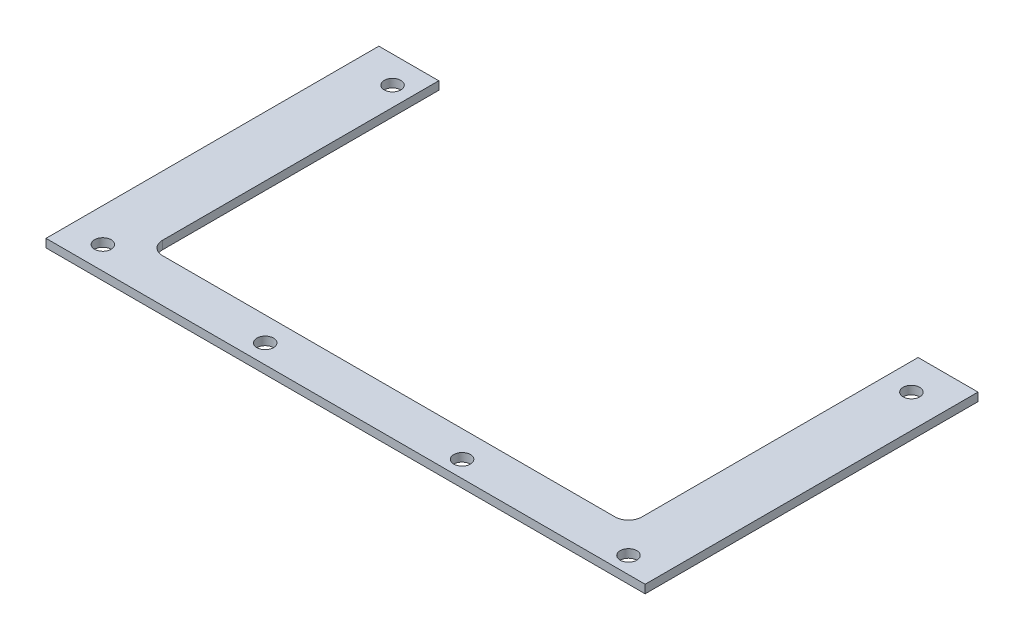
ISO-10303-21;
HEADER;
FILE_DESCRIPTION(('STEP AP214'),'2;1');
FILE_NAME('part.step','',(''),(''),'','','');
FILE_SCHEMA(('AUTOMOTIVE_DESIGN { 1 0 10303 214 1 1 1 1 }'));
ENDSEC;
DATA;
#1=APPLICATION_CONTEXT('core data for automotive mechanical design processes');
#2=APPLICATION_PROTOCOL_DEFINITION('international standard','automotive_design',2000,#1);
#3=PRODUCT_CONTEXT('',#1,'mechanical');
#4=PRODUCT('Part','Part','',(#3));
#5=PRODUCT_RELATED_PRODUCT_CATEGORY('part','',(#4));
#6=PRODUCT_DEFINITION_FORMATION('','',#4);
#7=PRODUCT_DEFINITION_CONTEXT('part definition',#1,'design');
#8=PRODUCT_DEFINITION('design','',#6,#7);
#9=PRODUCT_DEFINITION_SHAPE('','',#8);
#10=(LENGTH_UNIT() NAMED_UNIT(*) SI_UNIT(.MILLI.,.METRE.));
#11=(NAMED_UNIT(*) PLANE_ANGLE_UNIT() SI_UNIT($,.RADIAN.));
#12=(NAMED_UNIT(*) SI_UNIT($,.STERADIAN.) SOLID_ANGLE_UNIT());
#13=UNCERTAINTY_MEASURE_WITH_UNIT(LENGTH_MEASURE(1.E-05),#10,'distance_accuracy_value','');
#14=(GEOMETRIC_REPRESENTATION_CONTEXT(3) GLOBAL_UNCERTAINTY_ASSIGNED_CONTEXT((#13)) GLOBAL_UNIT_ASSIGNED_CONTEXT((#10,
#11,#12)) REPRESENTATION_CONTEXT('',''));
#15=CARTESIAN_POINT('',(0.,0.,0.));
#16=DIRECTION('',(0.,0.,1.));
#17=DIRECTION('',(1.,0.,0.));
#18=AXIS2_PLACEMENT_3D('',#15,#16,#17);
#19=CARTESIAN_POINT('',(-86.3600000000036,28.575000000001,-237.490000000001));
#20=DIRECTION('',(0.,-1.,0.));
#21=DIRECTION('',(0.,0.,-1.));
#22=AXIS2_PLACEMENT_3D('',#19,#20,#21);
#23=CYLINDRICAL_SURFACE('',#22,5.07999999999998);
#24=CARTESIAN_POINT('',(-86.3600000000036,25.400000000001,-237.490000000001));
#25=DIRECTION('',(0.,1.,0.));
#26=DIRECTION('',(-1.,0.,0.));
#27=AXIS2_PLACEMENT_3D('',#24,#25,#26);
#28=CIRCLE('',#27,5.07999999999998);
#29=CARTESIAN_POINT('',(-91.4400000000036,25.400000000001,-237.490000000001));
#30=VERTEX_POINT('',#29);
#31=CARTESIAN_POINT('',(-86.3600000000036,25.400000000001,-232.410000000001));
#32=VERTEX_POINT('',#31);
#33=EDGE_CURVE('E142',#30,#32,#28,.T.);
#34=ORIENTED_EDGE('',*,*,#33,.F.);
#35=DIRECTION('',(0.,-1.,0.));
#36=VECTOR('',#35,1.);
#37=CARTESIAN_POINT('',(-91.4400000000036,28.575000000001,-237.490000000001));
#38=LINE('',#37,#36);
#39=CARTESIAN_POINT('',(-91.4400000000036,28.575000000001,-237.490000000001));
#40=VERTEX_POINT('',#39);
#41=EDGE_CURVE('E11',#40,#30,#38,.T.);
#42=ORIENTED_EDGE('',*,*,#41,.F.);
#43=CARTESIAN_POINT('',(-86.3600000000036,28.575000000001,-237.490000000001));
#44=DIRECTION('',(0.,1.,0.));
#45=DIRECTION('',(-1.,0.,0.));
#46=AXIS2_PLACEMENT_3D('',#43,#44,#45);
#47=CIRCLE('',#46,5.07999999999998);
#48=CARTESIAN_POINT('',(-86.3600000000036,28.575000000001,-232.410000000001));
#49=VERTEX_POINT('',#48);
#50=EDGE_CURVE('E166',#40,#49,#47,.T.);
#51=ORIENTED_EDGE('',*,*,#50,.T.);
#52=DIRECTION('',(0.,-1.,0.));
#53=VECTOR('',#52,1.);
#54=CARTESIAN_POINT('',(-86.3600000000036,28.575000000001,-232.410000000001));
#55=LINE('',#54,#53);
#56=EDGE_CURVE('E53',#49,#32,#55,.T.);
#57=ORIENTED_EDGE('',*,*,#56,.T.);
#58=EDGE_LOOP('',(#34,#42,#51,#57));
#59=FACE_BOUND('',#58,.T.);
#60=ADVANCED_FACE('F37',(#59),#23,.F.);
#61=CARTESIAN_POINT('',(-91.4400000000036,28.5750000000009,0.));
#62=DIRECTION('',(-1.,0.,0.));
#63=DIRECTION('',(0.,0.,1.));
#64=AXIS2_PLACEMENT_3D('',#61,#62,#63);
#65=PLANE('',#64);
#66=DIRECTION('',(0.,0.,-1.));
#67=VECTOR('',#66,1.);
#68=CARTESIAN_POINT('',(-91.4400000000036,25.4000000000009,0.));
#69=LINE('',#68,#67);
#70=CARTESIAN_POINT('',(-91.4400000000035,25.400000000001,-342.899999999985));
#71=VERTEX_POINT('',#70);
#72=EDGE_CURVE('E144',#30,#71,#69,.T.);
#73=ORIENTED_EDGE('',*,*,#72,.T.);
#74=DIRECTION('',(0.,-1.,0.));
#75=VECTOR('',#74,1.);
#76=CARTESIAN_POINT('',(-91.4400000000035,28.575000000001,-342.899999999985));
#77=LINE('',#76,#75);
#78=CARTESIAN_POINT('',(-91.4400000000035,28.575000000001,-342.899999999985));
#79=VERTEX_POINT('',#78);
#80=EDGE_CURVE('E45',#79,#71,#77,.T.);
#81=ORIENTED_EDGE('',*,*,#80,.F.);
#82=DIRECTION('',(0.,0.,-1.));
#83=VECTOR('',#82,1.);
#84=CARTESIAN_POINT('',(-91.4400000000036,28.5750000000009,0.));
#85=LINE('',#84,#83);
#86=EDGE_CURVE('E199',#40,#79,#85,.T.);
#87=ORIENTED_EDGE('',*,*,#86,.F.);
#88=ORIENTED_EDGE('',*,*,#41,.T.);
#89=EDGE_LOOP('',(#73,#81,#87,#88));
#90=FACE_BOUND('',#89,.T.);
#91=ADVANCED_FACE('F187',(#90),#65,.F.);
#92=CARTESIAN_POINT('',(0.,28.575000000001,-342.899999999985));
#93=DIRECTION('',(0.,0.,-1.));
#94=DIRECTION('',(0.,1.,0.));
#95=AXIS2_PLACEMENT_3D('',#92,#93,#94);
#96=PLANE('',#95);
#97=DIRECTION('',(1.,0.,0.));
#98=VECTOR('',#97,1.);
#99=CARTESIAN_POINT('',(0.,25.400000000001,-342.899999999985));
#100=LINE('',#99,#98);
#101=CARTESIAN_POINT('',(-114.300000000203,25.400000000001,-342.899999999985));
#102=VERTEX_POINT('',#101);
#103=EDGE_CURVE('E148',#102,#71,#100,.T.);
#104=ORIENTED_EDGE('',*,*,#103,.F.);
#105=DIRECTION('',(0.,-1.,0.));
#106=VECTOR('',#105,1.);
#107=CARTESIAN_POINT('',(-114.300000000203,28.575000000001,-342.899999999985));
#108=LINE('',#107,#106);
#109=CARTESIAN_POINT('',(-114.300000000203,28.575000000001,-342.899999999985));
#110=VERTEX_POINT('',#109);
#111=EDGE_CURVE('E177',#110,#102,#108,.T.);
#112=ORIENTED_EDGE('',*,*,#111,.F.);
#113=DIRECTION('',(1.,0.,0.));
#114=VECTOR('',#113,1.);
#115=CARTESIAN_POINT('',(0.,28.575000000001,-342.899999999985));
#116=LINE('',#115,#114);
#117=EDGE_CURVE('E184',#110,#79,#116,.T.);
#118=ORIENTED_EDGE('',*,*,#117,.T.);
#119=ORIENTED_EDGE('',*,*,#80,.T.);
#120=EDGE_LOOP('',(#104,#112,#118,#119));
#121=FACE_BOUND('',#120,.T.);
#122=ADVANCED_FACE('F182',(#121),#96,.T.);
#123=CARTESIAN_POINT('',(-114.300000000203,28.5750000000009,0.));
#124=DIRECTION('',(-1.,0.,0.));
#125=DIRECTION('',(0.,-1.,0.));
#126=AXIS2_PLACEMENT_3D('',#123,#124,#125);
#127=PLANE('',#126);
#128=DIRECTION('',(0.,0.,-1.));
#129=VECTOR('',#128,1.);
#130=CARTESIAN_POINT('',(-114.300000000203,25.4000000000009,0.));
#131=LINE('',#130,#129);
#132=CARTESIAN_POINT('',(-114.300000000203,25.400000000001,-215.899999999985));
#133=VERTEX_POINT('',#132);
#134=EDGE_CURVE('E151',#133,#102,#131,.T.);
#135=ORIENTED_EDGE('',*,*,#134,.F.);
#136=DIRECTION('',(0.,-1.,0.));
#137=VECTOR('',#136,1.);
#138=CARTESIAN_POINT('',(-114.300000000203,28.575000000001,-215.899999999985));
#139=LINE('',#138,#137);
#140=CARTESIAN_POINT('',(-114.300000000203,28.575000000001,-215.899999999985));
#141=VERTEX_POINT('',#140);
#142=EDGE_CURVE('E175',#141,#133,#139,.T.);
#143=ORIENTED_EDGE('',*,*,#142,.F.);
#144=DIRECTION('',(0.,0.,-1.));
#145=VECTOR('',#144,1.);
#146=CARTESIAN_POINT('',(-114.300000000203,28.5750000000009,0.));
#147=LINE('',#146,#145);
#148=EDGE_CURVE('E198',#141,#110,#147,.T.);
#149=ORIENTED_EDGE('',*,*,#148,.T.);
#150=ORIENTED_EDGE('',*,*,#111,.T.);
#151=EDGE_LOOP('',(#135,#143,#149,#150));
#152=FACE_BOUND('',#151,.T.);
#153=ADVANCED_FACE('F194',(#152),#127,.T.);
#154=CARTESIAN_POINT('',(0.,28.575000000001,-215.899999999986));
#155=DIRECTION('',(0.,0.,-1.));
#156=DIRECTION('',(0.,1.,0.));
#157=AXIS2_PLACEMENT_3D('',#154,#155,#156);
#158=PLANE('',#157);
#159=DIRECTION('',(1.,0.,0.));
#160=VECTOR('',#159,1.);
#161=CARTESIAN_POINT('',(0.,25.400000000001,-215.899999999986));
#162=LINE('',#161,#160);
#163=CARTESIAN_POINT('',(114.299999999797,25.400000000001,-215.899999999986));
#164=VERTEX_POINT('',#163);
#165=EDGE_CURVE('E155',#133,#164,#162,.T.);
#166=ORIENTED_EDGE('',*,*,#165,.T.);
#167=DIRECTION('',(0.,-1.,0.));
#168=VECTOR('',#167,1.);
#169=CARTESIAN_POINT('',(114.299999999797,28.575000000001,-215.899999999986));
#170=LINE('',#169,#168);
#171=CARTESIAN_POINT('',(114.299999999797,28.575000000001,-215.899999999986));
#172=VERTEX_POINT('',#171);
#173=EDGE_CURVE('E172',#172,#164,#170,.T.);
#174=ORIENTED_EDGE('',*,*,#173,.F.);
#175=DIRECTION('',(1.,0.,0.));
#176=VECTOR('',#175,1.);
#177=CARTESIAN_POINT('',(0.,28.575000000001,-215.899999999986));
#178=LINE('',#177,#176);
#179=EDGE_CURVE('E201',#141,#172,#178,.T.);
#180=ORIENTED_EDGE('',*,*,#179,.F.);
#181=ORIENTED_EDGE('',*,*,#142,.T.);
#182=EDGE_LOOP('',(#166,#174,#180,#181));
#183=FACE_BOUND('',#182,.T.);
#184=ADVANCED_FACE('F211',(#183),#158,.F.);
#185=CARTESIAN_POINT('',(114.299999999797,28.575000000001,0.));
#186=DIRECTION('',(-1.,0.,0.));
#187=DIRECTION('',(0.,-1.,0.));
#188=AXIS2_PLACEMENT_3D('',#185,#186,#187);
#189=PLANE('',#188);
#190=DIRECTION('',(0.,0.,-1.));
#191=VECTOR('',#190,1.);
#192=CARTESIAN_POINT('',(114.299999999797,25.400000000001,0.));
#193=LINE('',#192,#191);
#194=CARTESIAN_POINT('',(114.299999999797,25.400000000001,-342.899999999986));
#195=VERTEX_POINT('',#194);
#196=EDGE_CURVE('E157',#164,#195,#193,.T.);
#197=ORIENTED_EDGE('',*,*,#196,.T.);
#198=DIRECTION('',(0.,-1.,0.));
#199=VECTOR('',#198,1.);
#200=CARTESIAN_POINT('',(114.299999999797,28.575000000001,-342.899999999986));
#201=LINE('',#200,#199);
#202=CARTESIAN_POINT('',(114.299999999797,28.575000000001,-342.899999999986));
#203=VERTEX_POINT('',#202);
#204=EDGE_CURVE('E170',#203,#195,#201,.T.);
#205=ORIENTED_EDGE('',*,*,#204,.F.);
#206=DIRECTION('',(0.,0.,-1.));
#207=VECTOR('',#206,1.);
#208=CARTESIAN_POINT('',(114.299999999797,28.575000000001,0.));
#209=LINE('',#208,#207);
#210=EDGE_CURVE('E204',#172,#203,#209,.T.);
#211=ORIENTED_EDGE('',*,*,#210,.F.);
#212=ORIENTED_EDGE('',*,*,#173,.T.);
#213=EDGE_LOOP('',(#197,#205,#211,#212));
#214=FACE_BOUND('',#213,.T.);
#215=ADVANCED_FACE('F213',(#214),#189,.F.);
#216=CARTESIAN_POINT('',(91.4399999999965,25.400000000001,-342.899999999985));
#217=VERTEX_POINT('',#216);
#218=EDGE_CURVE('E152',#217,#195,#100,.T.);
#219=ORIENTED_EDGE('',*,*,#218,.F.);
#220=DIRECTION('',(0.,-1.,0.));
#221=VECTOR('',#220,1.);
#222=CARTESIAN_POINT('',(91.4399999999965,28.575000000001,-342.899999999985));
#223=LINE('',#222,#221);
#224=CARTESIAN_POINT('',(91.4399999999965,28.575000000001,-342.899999999985));
#225=VERTEX_POINT('',#224);
#226=EDGE_CURVE('E134',#225,#217,#223,.T.);
#227=ORIENTED_EDGE('',*,*,#226,.F.);
#228=EDGE_CURVE('E124',#225,#203,#116,.T.);
#229=ORIENTED_EDGE('',*,*,#228,.T.);
#230=ORIENTED_EDGE('',*,*,#204,.T.);
#231=EDGE_LOOP('',(#219,#227,#229,#230));
#232=FACE_BOUND('',#231,.T.);
#233=ADVANCED_FACE('F216',(#232),#96,.T.);
#234=CARTESIAN_POINT('',(91.4399999999966,28.575000000001,0.));
#235=DIRECTION('',(1.,0.,0.));
#236=DIRECTION('',(0.,0.,-1.));
#237=AXIS2_PLACEMENT_3D('',#234,#235,#236);
#238=PLANE('',#237);
#239=DIRECTION('',(0.,0.,1.));
#240=VECTOR('',#239,1.);
#241=CARTESIAN_POINT('',(91.4399999999966,25.400000000001,0.));
#242=LINE('',#241,#240);
#243=CARTESIAN_POINT('',(91.4399999999965,25.400000000001,-237.490000000001));
#244=VERTEX_POINT('',#243);
#245=EDGE_CURVE('E131',#217,#244,#242,.T.);
#246=ORIENTED_EDGE('',*,*,#245,.T.);
#247=DIRECTION('',(0.,-1.,0.));
#248=VECTOR('',#247,1.);
#249=CARTESIAN_POINT('',(91.4399999999965,28.575000000001,-237.490000000001));
#250=LINE('',#249,#248);
#251=CARTESIAN_POINT('',(91.4399999999965,28.575000000001,-237.490000000001));
#252=VERTEX_POINT('',#251);
#253=EDGE_CURVE('E128',#252,#244,#250,.T.);
#254=ORIENTED_EDGE('',*,*,#253,.F.);
#255=DIRECTION('',(0.,0.,1.));
#256=VECTOR('',#255,1.);
#257=CARTESIAN_POINT('',(91.4399999999966,28.575000000001,0.));
#258=LINE('',#257,#256);
#259=EDGE_CURVE('E116',#225,#252,#258,.T.);
#260=ORIENTED_EDGE('',*,*,#259,.F.);
#261=ORIENTED_EDGE('',*,*,#226,.T.);
#262=EDGE_LOOP('',(#246,#254,#260,#261));
#263=FACE_BOUND('',#262,.T.);
#264=ADVANCED_FACE('F129',(#263),#238,.F.);
#265=CARTESIAN_POINT('',(86.3599999999965,28.575000000001,-237.490000000001));
#266=DIRECTION('',(0.,-1.,0.));
#267=DIRECTION('',(0.,0.,-1.));
#268=AXIS2_PLACEMENT_3D('',#265,#266,#267);
#269=CYLINDRICAL_SURFACE('',#268,5.07999999999998);
#270=CARTESIAN_POINT('',(86.3599999999965,25.400000000001,-237.490000000001));
#271=DIRECTION('',(0.,1.,0.));
#272=DIRECTION('',(-1.,0.,0.));
#273=AXIS2_PLACEMENT_3D('',#270,#271,#272);
#274=CIRCLE('',#273,5.07999999999998);
#275=CARTESIAN_POINT('',(86.3599999999965,25.400000000001,-232.410000000001));
#276=VERTEX_POINT('',#275);
#277=EDGE_CURVE('E161',#276,#244,#274,.T.);
#278=ORIENTED_EDGE('',*,*,#277,.F.);
#279=DIRECTION('',(0.,-1.,0.));
#280=VECTOR('',#279,1.);
#281=CARTESIAN_POINT('',(86.3599999999965,28.575000000001,-232.410000000001));
#282=LINE('',#281,#280);
#283=CARTESIAN_POINT('',(86.3599999999965,28.575000000001,-232.410000000001));
#284=VERTEX_POINT('',#283);
#285=EDGE_CURVE('E84',#284,#276,#282,.T.);
#286=ORIENTED_EDGE('',*,*,#285,.F.);
#287=CARTESIAN_POINT('',(86.3599999999965,28.575000000001,-237.490000000001));
#288=DIRECTION('',(0.,1.,0.));
#289=DIRECTION('',(-1.,0.,0.));
#290=AXIS2_PLACEMENT_3D('',#287,#288,#289);
#291=CIRCLE('',#290,5.07999999999998);
#292=EDGE_CURVE('E122',#284,#252,#291,.T.);
#293=ORIENTED_EDGE('',*,*,#292,.T.);
#294=ORIENTED_EDGE('',*,*,#253,.T.);
#295=EDGE_LOOP('',(#278,#286,#293,#294));
#296=FACE_BOUND('',#295,.T.);
#297=ADVANCED_FACE('F136',(#296),#269,.F.);
#298=CARTESIAN_POINT('',(0.,28.575000000001,-232.410000000001));
#299=DIRECTION('',(0.,0.,-1.));
#300=DIRECTION('',(-1.,0.,0.));
#301=AXIS2_PLACEMENT_3D('',#298,#299,#300);
#302=PLANE('',#301);
#303=DIRECTION('',(1.,0.,0.));
#304=VECTOR('',#303,1.);
#305=CARTESIAN_POINT('',(0.,25.400000000001,-232.410000000001));
#306=LINE('',#305,#304);
#307=EDGE_CURVE('E163',#32,#276,#306,.T.);
#308=ORIENTED_EDGE('',*,*,#307,.F.);
#309=ORIENTED_EDGE('',*,*,#56,.F.);
#310=DIRECTION('',(1.,0.,0.));
#311=VECTOR('',#310,1.);
#312=CARTESIAN_POINT('',(0.,28.575000000001,-232.410000000001));
#313=LINE('',#312,#311);
#314=EDGE_CURVE('E137',#49,#284,#313,.T.);
#315=ORIENTED_EDGE('',*,*,#314,.T.);
#316=ORIENTED_EDGE('',*,*,#285,.T.);
#317=EDGE_LOOP('',(#308,#309,#315,#316));
#318=FACE_BOUND('',#317,.T.);
#319=ADVANCED_FACE('F217',(#318),#302,.T.);
#320=CARTESIAN_POINT('',(0.,28.575000000001,0.));
#321=DIRECTION('',(0.,1.,0.));
#322=DIRECTION('',(-1.,0.,0.));
#323=AXIS2_PLACEMENT_3D('',#320,#321,#322);
#324=PLANE('',#323);
#325=CARTESIAN_POINT('',(101.599999999898,28.575000000001,-330.2));
#326=DIRECTION('',(0.,1.,0.));
#327=DIRECTION('',(0.,0.,1.));
#328=AXIS2_PLACEMENT_3D('',#325,#326,#327);
#329=CIRCLE('',#328,3.17499999999998);
#330=CARTESIAN_POINT('',(101.599999999898,28.575000000001,-327.025));
#331=VERTEX_POINT('',#330);
#332=EDGE_CURVE('E345',#331,#331,#329,.T.);
#333=ORIENTED_EDGE('',*,*,#332,.F.);
#334=EDGE_LOOP('',(#333));
#335=FACE_BOUND('',#334,.T.);
#336=CARTESIAN_POINT('',(101.599999999898,28.575000000001,-222.249999999986));
#337=DIRECTION('',(0.,1.,0.));
#338=DIRECTION('',(0.,0.,1.));
#339=AXIS2_PLACEMENT_3D('',#336,#337,#338);
#340=CIRCLE('',#339,3.17499999999998);
#341=CARTESIAN_POINT('',(101.599999999898,28.575000000001,-219.074999999986));
#342=VERTEX_POINT('',#341);
#343=EDGE_CURVE('E347',#342,#342,#340,.T.);
#344=ORIENTED_EDGE('',*,*,#343,.F.);
#345=EDGE_LOOP('',(#344));
#346=FACE_BOUND('',#345,.T.);
#347=CARTESIAN_POINT('',(38.0999999997969,28.575000000001,-222.249999999986));
#348=DIRECTION('',(0.,1.,0.));
#349=DIRECTION('',(0.,0.,1.));
#350=AXIS2_PLACEMENT_3D('',#347,#348,#349);
#351=CIRCLE('',#350,3.17499999999998);
#352=CARTESIAN_POINT('',(38.0999999997969,28.575000000001,-219.074999999986));
#353=VERTEX_POINT('',#352);
#354=EDGE_CURVE('E355',#353,#353,#351,.T.);
#355=ORIENTED_EDGE('',*,*,#354,.F.);
#356=EDGE_LOOP('',(#355));
#357=FACE_BOUND('',#356,.T.);
#358=CARTESIAN_POINT('',(-98.8024635575989,28.575000000001,-332.626703007189));
#359=DIRECTION('',(0.,1.,0.));
#360=DIRECTION('',(0.,0.,1.));
#361=AXIS2_PLACEMENT_3D('',#358,#359,#360);
#362=CIRCLE('',#361,3.17499999999998);
#363=CARTESIAN_POINT('',(-98.8024635575989,28.575000000001,-329.451703007189));
#364=VERTEX_POINT('',#363);
#365=EDGE_CURVE('E361',#364,#364,#362,.T.);
#366=ORIENTED_EDGE('',*,*,#365,.F.);
#367=EDGE_LOOP('',(#366));
#368=FACE_BOUND('',#367,.T.);
#369=CARTESIAN_POINT('',(-101.416445228806,28.575000000001,-224.708356097011));
#370=DIRECTION('',(0.,1.,0.));
#371=DIRECTION('',(0.,0.,1.));
#372=AXIS2_PLACEMENT_3D('',#369,#370,#371);
#373=CIRCLE('',#372,3.17499999999998);
#374=CARTESIAN_POINT('',(-101.416445228806,28.575000000001,-221.533356097011));
#375=VERTEX_POINT('',#374);
#376=EDGE_CURVE('E367',#375,#375,#373,.T.);
#377=ORIENTED_EDGE('',*,*,#376,.F.);
#378=EDGE_LOOP('',(#377));
#379=FACE_BOUND('',#378,.T.);
#380=CARTESIAN_POINT('',(-37.9350646933135,28.575000000001,-223.170719819828));
#381=DIRECTION('',(0.,1.,0.));
#382=DIRECTION('',(0.,0.,1.));
#383=AXIS2_PLACEMENT_3D('',#380,#381,#382);
#384=CIRCLE('',#383,3.17499999999998);
#385=CARTESIAN_POINT('',(-37.9350646933135,28.575000000001,-219.995719819828));
#386=VERTEX_POINT('',#385);
#387=EDGE_CURVE('E373',#386,#386,#384,.T.);
#388=ORIENTED_EDGE('',*,*,#387,.F.);
#389=EDGE_LOOP('',(#388));
#390=FACE_BOUND('',#389,.T.);
#391=ORIENTED_EDGE('',*,*,#50,.F.);
#392=ORIENTED_EDGE('',*,*,#86,.T.);
#393=ORIENTED_EDGE('',*,*,#117,.F.);
#394=ORIENTED_EDGE('',*,*,#148,.F.);
#395=ORIENTED_EDGE('',*,*,#179,.T.);
#396=ORIENTED_EDGE('',*,*,#210,.T.);
#397=ORIENTED_EDGE('',*,*,#228,.F.);
#398=ORIENTED_EDGE('',*,*,#259,.T.);
#399=ORIENTED_EDGE('',*,*,#292,.F.);
#400=ORIENTED_EDGE('',*,*,#314,.F.);
#401=EDGE_LOOP('',(#391,#392,#393,#394,#395,#396,#397,#398,#399,#400));
#402=FACE_BOUND('',#401,.T.);
#403=ADVANCED_FACE('F119',(#335,#346,#357,#368,#379,#390,#402),#324,.T.);
#404=CARTESIAN_POINT('',(0.,25.400000000001,0.));
#405=DIRECTION('',(0.,1.,0.));
#406=DIRECTION('',(-1.,0.,0.));
#407=AXIS2_PLACEMENT_3D('',#404,#405,#406);
#408=PLANE('',#407);
#409=CARTESIAN_POINT('',(101.599999999898,25.400000000001,-330.2));
#410=DIRECTION('',(0.,1.,0.));
#411=DIRECTION('',(0.,0.,1.));
#412=AXIS2_PLACEMENT_3D('',#409,#410,#411);
#413=CIRCLE('',#412,3.17499999999998);
#414=CARTESIAN_POINT('',(101.599999999898,25.400000000001,-327.025));
#415=VERTEX_POINT('',#414);
#416=EDGE_CURVE('E342',#415,#415,#413,.T.);
#417=ORIENTED_EDGE('',*,*,#416,.T.);
#418=EDGE_LOOP('',(#417));
#419=FACE_BOUND('',#418,.T.);
#420=CARTESIAN_POINT('',(101.599999999898,25.400000000001,-222.249999999986));
#421=DIRECTION('',(0.,1.,0.));
#422=DIRECTION('',(0.,0.,1.));
#423=AXIS2_PLACEMENT_3D('',#420,#421,#422);
#424=CIRCLE('',#423,3.17499999999998);
#425=CARTESIAN_POINT('',(101.599999999898,25.400000000001,-219.074999999986));
#426=VERTEX_POINT('',#425);
#427=EDGE_CURVE('E352',#426,#426,#424,.T.);
#428=ORIENTED_EDGE('',*,*,#427,.T.);
#429=EDGE_LOOP('',(#428));
#430=FACE_BOUND('',#429,.T.);
#431=CARTESIAN_POINT('',(38.0999999997969,25.400000000001,-222.249999999986));
#432=DIRECTION('',(0.,1.,0.));
#433=DIRECTION('',(0.,0.,1.));
#434=AXIS2_PLACEMENT_3D('',#431,#432,#433);
#435=CIRCLE('',#434,3.17499999999999);
#436=CARTESIAN_POINT('',(38.0999999997969,25.400000000001,-219.074999999986));
#437=VERTEX_POINT('',#436);
#438=EDGE_CURVE('E358',#437,#437,#435,.T.);
#439=ORIENTED_EDGE('',*,*,#438,.T.);
#440=EDGE_LOOP('',(#439));
#441=FACE_BOUND('',#440,.T.);
#442=CARTESIAN_POINT('',(-98.8024635575989,25.400000000001,-332.626703007189));
#443=DIRECTION('',(0.,1.,0.));
#444=DIRECTION('',(0.,0.,1.));
#445=AXIS2_PLACEMENT_3D('',#442,#443,#444);
#446=CIRCLE('',#445,3.17499999999998);
#447=CARTESIAN_POINT('',(-98.8024635575989,25.400000000001,-329.451703007189));
#448=VERTEX_POINT('',#447);
#449=EDGE_CURVE('E364',#448,#448,#446,.T.);
#450=ORIENTED_EDGE('',*,*,#449,.T.);
#451=EDGE_LOOP('',(#450));
#452=FACE_BOUND('',#451,.T.);
#453=CARTESIAN_POINT('',(-101.416445228806,25.400000000001,-224.708356097011));
#454=DIRECTION('',(0.,1.,0.));
#455=DIRECTION('',(0.,0.,1.));
#456=AXIS2_PLACEMENT_3D('',#453,#454,#455);
#457=CIRCLE('',#456,3.17499999999998);
#458=CARTESIAN_POINT('',(-101.416445228806,25.400000000001,-221.533356097011));
#459=VERTEX_POINT('',#458);
#460=EDGE_CURVE('E370',#459,#459,#457,.T.);
#461=ORIENTED_EDGE('',*,*,#460,.T.);
#462=EDGE_LOOP('',(#461));
#463=FACE_BOUND('',#462,.T.);
#464=CARTESIAN_POINT('',(-37.9350646933135,25.400000000001,-223.170719819828));
#465=DIRECTION('',(0.,1.,0.));
#466=DIRECTION('',(0.,0.,1.));
#467=AXIS2_PLACEMENT_3D('',#464,#465,#466);
#468=CIRCLE('',#467,3.17499999999999);
#469=CARTESIAN_POINT('',(-37.9350646933135,25.400000000001,-219.995719819828));
#470=VERTEX_POINT('',#469);
#471=EDGE_CURVE('E145',#470,#470,#468,.T.);
#472=ORIENTED_EDGE('',*,*,#471,.T.);
#473=EDGE_LOOP('',(#472));
#474=FACE_BOUND('',#473,.T.);
#475=ORIENTED_EDGE('',*,*,#33,.T.);
#476=ORIENTED_EDGE('',*,*,#307,.T.);
#477=ORIENTED_EDGE('',*,*,#277,.T.);
#478=ORIENTED_EDGE('',*,*,#245,.F.);
#479=ORIENTED_EDGE('',*,*,#218,.T.);
#480=ORIENTED_EDGE('',*,*,#196,.F.);
#481=ORIENTED_EDGE('',*,*,#165,.F.);
#482=ORIENTED_EDGE('',*,*,#134,.T.);
#483=ORIENTED_EDGE('',*,*,#103,.T.);
#484=ORIENTED_EDGE('',*,*,#72,.F.);
#485=EDGE_LOOP('',(#475,#476,#477,#478,#479,#480,#481,#482,#483,#484));
#486=FACE_BOUND('',#485,.T.);
#487=ADVANCED_FACE('F189',(#419,#430,#441,#452,#463,#474,#486),#408,.F.);
#488=CARTESIAN_POINT('',(-37.9350646933135,28.575000000001,-223.170719819828));
#489=DIRECTION('',(0.,1.,0.));
#490=DIRECTION('',(0.,0.,1.));
#491=AXIS2_PLACEMENT_3D('',#488,#489,#490);
#492=CYLINDRICAL_SURFACE('',#491,3.17499999999999);
#493=ORIENTED_EDGE('',*,*,#471,.F.);
#494=EDGE_LOOP('',(#493));
#495=FACE_BOUND('',#494,.T.);
#496=ORIENTED_EDGE('',*,*,#387,.T.);
#497=EDGE_LOOP('',(#496));
#498=FACE_BOUND('',#497,.T.);
#499=ADVANCED_FACE('F275',(#495,#498),#492,.F.);
#500=CARTESIAN_POINT('',(-101.416445228806,28.575000000001,-224.708356097011));
#501=DIRECTION('',(0.,1.,0.));
#502=DIRECTION('',(0.,0.,1.));
#503=AXIS2_PLACEMENT_3D('',#500,#501,#502);
#504=CYLINDRICAL_SURFACE('',#503,3.17499999999998);
#505=ORIENTED_EDGE('',*,*,#460,.F.);
#506=EDGE_LOOP('',(#505));
#507=FACE_BOUND('',#506,.T.);
#508=ORIENTED_EDGE('',*,*,#376,.T.);
#509=EDGE_LOOP('',(#508));
#510=FACE_BOUND('',#509,.T.);
#511=ADVANCED_FACE('F285',(#507,#510),#504,.F.);
#512=CARTESIAN_POINT('',(-98.8024635575989,28.575000000001,-332.626703007189));
#513=DIRECTION('',(0.,1.,0.));
#514=DIRECTION('',(0.,0.,1.));
#515=AXIS2_PLACEMENT_3D('',#512,#513,#514);
#516=CYLINDRICAL_SURFACE('',#515,3.17499999999998);
#517=ORIENTED_EDGE('',*,*,#449,.F.);
#518=EDGE_LOOP('',(#517));
#519=FACE_BOUND('',#518,.T.);
#520=ORIENTED_EDGE('',*,*,#365,.T.);
#521=EDGE_LOOP('',(#520));
#522=FACE_BOUND('',#521,.T.);
#523=ADVANCED_FACE('F295',(#519,#522),#516,.F.);
#524=CARTESIAN_POINT('',(38.0999999997969,28.575000000001,-222.249999999986));
#525=DIRECTION('',(0.,1.,0.));
#526=DIRECTION('',(0.,0.,1.));
#527=AXIS2_PLACEMENT_3D('',#524,#525,#526);
#528=CYLINDRICAL_SURFACE('',#527,3.17499999999999);
#529=ORIENTED_EDGE('',*,*,#438,.F.);
#530=EDGE_LOOP('',(#529));
#531=FACE_BOUND('',#530,.T.);
#532=ORIENTED_EDGE('',*,*,#354,.T.);
#533=EDGE_LOOP('',(#532));
#534=FACE_BOUND('',#533,.T.);
#535=ADVANCED_FACE('F305',(#531,#534),#528,.F.);
#536=CARTESIAN_POINT('',(101.599999999898,28.575000000001,-222.249999999986));
#537=DIRECTION('',(0.,1.,0.));
#538=DIRECTION('',(0.,0.,1.));
#539=AXIS2_PLACEMENT_3D('',#536,#537,#538);
#540=CYLINDRICAL_SURFACE('',#539,3.17499999999998);
#541=ORIENTED_EDGE('',*,*,#427,.F.);
#542=EDGE_LOOP('',(#541));
#543=FACE_BOUND('',#542,.T.);
#544=ORIENTED_EDGE('',*,*,#343,.T.);
#545=EDGE_LOOP('',(#544));
#546=FACE_BOUND('',#545,.T.);
#547=ADVANCED_FACE('F315',(#543,#546),#540,.F.);
#548=CARTESIAN_POINT('',(101.599999999898,28.575000000001,-330.2));
#549=DIRECTION('',(0.,1.,0.));
#550=DIRECTION('',(0.,0.,1.));
#551=AXIS2_PLACEMENT_3D('',#548,#549,#550);
#552=CYLINDRICAL_SURFACE('',#551,3.17499999999998);
#553=ORIENTED_EDGE('',*,*,#416,.F.);
#554=EDGE_LOOP('',(#553));
#555=FACE_BOUND('',#554,.T.);
#556=ORIENTED_EDGE('',*,*,#332,.T.);
#557=EDGE_LOOP('',(#556));
#558=FACE_BOUND('',#557,.T.);
#559=ADVANCED_FACE('F325',(#555,#558),#552,.F.);
#560=CLOSED_SHELL('',(#60,#91,#122,#153,#184,#215,#233,#264,#297,#319,#403,#487,#499,#511,#523,
#535,#547,#559));
#561=MANIFOLD_SOLID_BREP('B2',#560);
#562=ADVANCED_BREP_SHAPE_REPRESENTATION('',(#18,#561),#14);
#563=SHAPE_DEFINITION_REPRESENTATION(#9,#562);
ENDSEC;
END-ISO-10303-21;
